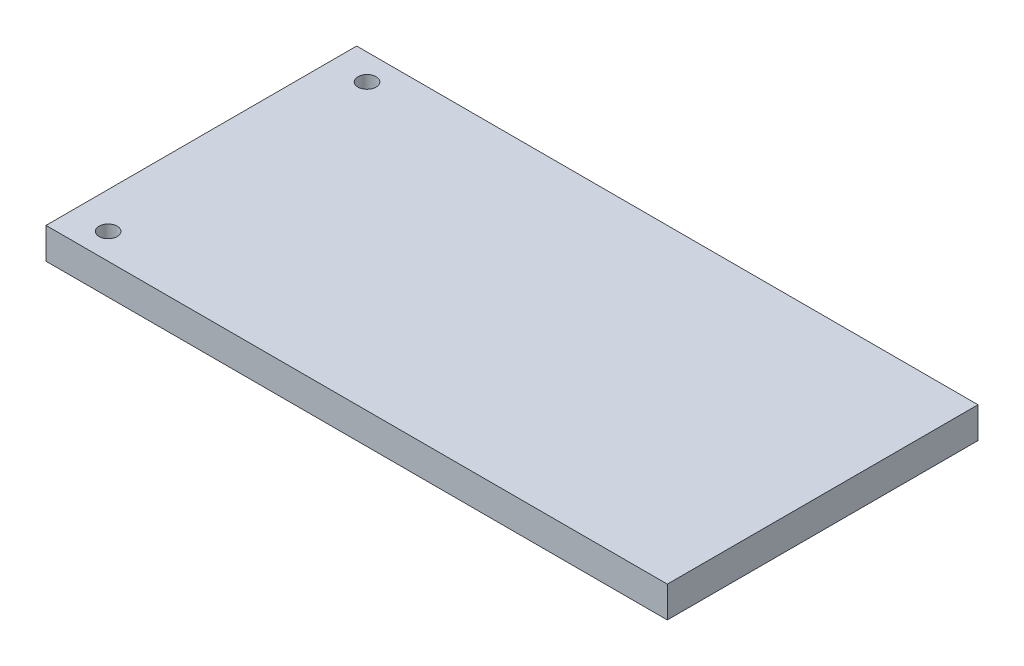
ISO-10303-21;
HEADER;
FILE_DESCRIPTION(('STEP AP214'),'2;1');
FILE_NAME('part.step','',(''),(''),'','','');
FILE_SCHEMA(('AUTOMOTIVE_DESIGN { 1 0 10303 214 1 1 1 1 }'));
ENDSEC;
DATA;
#1=APPLICATION_CONTEXT('core data for automotive mechanical design processes');
#2=APPLICATION_PROTOCOL_DEFINITION('international standard','automotive_design',2000,#1);
#3=PRODUCT_CONTEXT('',#1,'mechanical');
#4=PRODUCT('Part','Part','',(#3));
#5=PRODUCT_RELATED_PRODUCT_CATEGORY('part','',(#4));
#6=PRODUCT_DEFINITION_FORMATION('','',#4);
#7=PRODUCT_DEFINITION_CONTEXT('part definition',#1,'design');
#8=PRODUCT_DEFINITION('design','',#6,#7);
#9=PRODUCT_DEFINITION_SHAPE('','',#8);
#10=(LENGTH_UNIT() NAMED_UNIT(*) SI_UNIT(.MILLI.,.METRE.));
#11=(NAMED_UNIT(*) PLANE_ANGLE_UNIT() SI_UNIT($,.RADIAN.));
#12=(NAMED_UNIT(*) SI_UNIT($,.STERADIAN.) SOLID_ANGLE_UNIT());
#13=UNCERTAINTY_MEASURE_WITH_UNIT(LENGTH_MEASURE(1.E-05),#10,'distance_accuracy_value','');
#14=(GEOMETRIC_REPRESENTATION_CONTEXT(3) GLOBAL_UNCERTAINTY_ASSIGNED_CONTEXT((#13)) GLOBAL_UNIT_ASSIGNED_CONTEXT((#10,
#11,#12)) REPRESENTATION_CONTEXT('',''));
#15=CARTESIAN_POINT('',(0.,0.,0.));
#16=DIRECTION('',(0.,0.,1.));
#17=DIRECTION('',(1.,0.,0.));
#18=AXIS2_PLACEMENT_3D('',#15,#16,#17);
#19=CARTESIAN_POINT('',(0.,6.,0.));
#20=DIRECTION('',(0.,0.,1.));
#21=DIRECTION('',(1.,0.,0.));
#22=AXIS2_PLACEMENT_3D('',#19,#20,#21);
#23=PLANE('',#22);
#24=DIRECTION('',(-1.,0.,0.));
#25=VECTOR('',#24,1.);
#26=CARTESIAN_POINT('',(0.,0.,0.));
#27=LINE('',#26,#25);
#28=CARTESIAN_POINT('',(60.,0.,0.));
#29=VERTEX_POINT('',#28);
#30=CARTESIAN_POINT('',(-60.,0.,0.));
#31=VERTEX_POINT('',#30);
#32=EDGE_CURVE('E79',#29,#31,#27,.T.);
#33=ORIENTED_EDGE('',*,*,#32,.T.);
#34=DIRECTION('',(0.,-1.,0.));
#35=VECTOR('',#34,1.);
#36=CARTESIAN_POINT('',(-60.,6.,0.));
#37=LINE('',#36,#35);
#38=CARTESIAN_POINT('',(-60.,6.,0.));
#39=VERTEX_POINT('',#38);
#40=EDGE_CURVE('E11',#39,#31,#37,.T.);
#41=ORIENTED_EDGE('',*,*,#40,.F.);
#42=DIRECTION('',(-1.,0.,0.));
#43=VECTOR('',#42,1.);
#44=CARTESIAN_POINT('',(0.,6.,0.));
#45=LINE('',#44,#43);
#46=CARTESIAN_POINT('',(60.,6.,0.));
#47=VERTEX_POINT('',#46);
#48=EDGE_CURVE('E84',#47,#39,#45,.T.);
#49=ORIENTED_EDGE('',*,*,#48,.F.);
#50=DIRECTION('',(0.,-1.,0.));
#51=VECTOR('',#50,1.);
#52=CARTESIAN_POINT('',(60.,6.,0.));
#53=LINE('',#52,#51);
#54=EDGE_CURVE('E99',#47,#29,#53,.T.);
#55=ORIENTED_EDGE('',*,*,#54,.T.);
#56=EDGE_LOOP('',(#33,#41,#49,#55));
#57=FACE_BOUND('',#56,.T.);
#58=ADVANCED_FACE('F39',(#57),#23,.F.);
#59=CARTESIAN_POINT('',(-60.,6.,60.));
#60=DIRECTION('',(1.,0.,0.));
#61=DIRECTION('',(0.,0.,-1.));
#62=AXIS2_PLACEMENT_3D('',#59,#60,#61);
#63=PLANE('',#62);
#64=DIRECTION('',(0.,0.,1.));
#65=VECTOR('',#64,1.);
#66=CARTESIAN_POINT('',(-60.,0.,60.));
#67=LINE('',#66,#65);
#68=CARTESIAN_POINT('',(-60.,0.,60.));
#69=VERTEX_POINT('',#68);
#70=EDGE_CURVE('E95',#31,#69,#67,.T.);
#71=ORIENTED_EDGE('',*,*,#70,.T.);
#72=DIRECTION('',(0.,-1.,0.));
#73=VECTOR('',#72,1.);
#74=CARTESIAN_POINT('',(-60.,6.,60.));
#75=LINE('',#74,#73);
#76=CARTESIAN_POINT('',(-60.,6.,60.));
#77=VERTEX_POINT('',#76);
#78=EDGE_CURVE('E47',#77,#69,#75,.T.);
#79=ORIENTED_EDGE('',*,*,#78,.F.);
#80=DIRECTION('',(0.,0.,1.));
#81=VECTOR('',#80,1.);
#82=CARTESIAN_POINT('',(-60.,6.,60.));
#83=LINE('',#82,#81);
#84=EDGE_CURVE('E87',#39,#77,#83,.T.);
#85=ORIENTED_EDGE('',*,*,#84,.F.);
#86=ORIENTED_EDGE('',*,*,#40,.T.);
#87=EDGE_LOOP('',(#71,#79,#85,#86));
#88=FACE_BOUND('',#87,.T.);
#89=ADVANCED_FACE('F94',(#88),#63,.F.);
#90=CARTESIAN_POINT('',(60.,6.,60.));
#91=DIRECTION('',(0.,0.,-1.));
#92=DIRECTION('',(-1.,0.,0.));
#93=AXIS2_PLACEMENT_3D('',#90,#91,#92);
#94=PLANE('',#93);
#95=DIRECTION('',(1.,0.,0.));
#96=VECTOR('',#95,1.);
#97=CARTESIAN_POINT('',(60.,0.,60.));
#98=LINE('',#97,#96);
#99=CARTESIAN_POINT('',(60.,0.,60.));
#100=VERTEX_POINT('',#99);
#101=EDGE_CURVE('E72',#69,#100,#98,.T.);
#102=ORIENTED_EDGE('',*,*,#101,.T.);
#103=DIRECTION('',(0.,-1.,0.));
#104=VECTOR('',#103,1.);
#105=CARTESIAN_POINT('',(60.,6.,60.));
#106=LINE('',#105,#104);
#107=CARTESIAN_POINT('',(60.,6.,60.));
#108=VERTEX_POINT('',#107);
#109=EDGE_CURVE('E96',#108,#100,#106,.T.);
#110=ORIENTED_EDGE('',*,*,#109,.F.);
#111=DIRECTION('',(1.,0.,0.));
#112=VECTOR('',#111,1.);
#113=CARTESIAN_POINT('',(60.,6.,60.));
#114=LINE('',#113,#112);
#115=EDGE_CURVE('E91',#77,#108,#114,.T.);
#116=ORIENTED_EDGE('',*,*,#115,.F.);
#117=ORIENTED_EDGE('',*,*,#78,.T.);
#118=EDGE_LOOP('',(#102,#110,#116,#117));
#119=FACE_BOUND('',#118,.T.);
#120=ADVANCED_FACE('F97',(#119),#94,.F.);
#121=CARTESIAN_POINT('',(60.,6.,0.));
#122=DIRECTION('',(-1.,0.,0.));
#123=DIRECTION('',(0.,0.,1.));
#124=AXIS2_PLACEMENT_3D('',#121,#122,#123);
#125=PLANE('',#124);
#126=DIRECTION('',(0.,0.,-1.));
#127=VECTOR('',#126,1.);
#128=CARTESIAN_POINT('',(60.,0.,0.));
#129=LINE('',#128,#127);
#130=EDGE_CURVE('E107',#100,#29,#129,.T.);
#131=ORIENTED_EDGE('',*,*,#130,.T.);
#132=ORIENTED_EDGE('',*,*,#54,.F.);
#133=DIRECTION('',(0.,0.,-1.));
#134=VECTOR('',#133,1.);
#135=CARTESIAN_POINT('',(60.,6.,0.));
#136=LINE('',#135,#134);
#137=EDGE_CURVE('E55',#108,#47,#136,.T.);
#138=ORIENTED_EDGE('',*,*,#137,.F.);
#139=ORIENTED_EDGE('',*,*,#109,.T.);
#140=EDGE_LOOP('',(#131,#132,#138,#139));
#141=FACE_BOUND('',#140,.T.);
#142=ADVANCED_FACE('F112',(#141),#125,.F.);
#143=CARTESIAN_POINT('',(0.,6.,0.));
#144=DIRECTION('',(0.,-1.,0.));
#145=DIRECTION('',(0.,0.,-1.));
#146=AXIS2_PLACEMENT_3D('',#143,#144,#145);
#147=PLANE('',#146);
#148=CARTESIAN_POINT('',(-53.,6.,5.));
#149=DIRECTION('',(0.,1.,0.));
#150=DIRECTION('',(0.,0.,1.));
#151=AXIS2_PLACEMENT_3D('',#148,#149,#150);
#152=CIRCLE('',#151,1.75);
#153=CARTESIAN_POINT('',(-53.,6.,6.75));
#154=VERTEX_POINT('',#153);
#155=EDGE_CURVE('E142',#154,#154,#152,.T.);
#156=ORIENTED_EDGE('',*,*,#155,.F.);
#157=EDGE_LOOP('',(#156));
#158=FACE_BOUND('',#157,.T.);
#159=CARTESIAN_POINT('',(-53.,6.,55.));
#160=DIRECTION('',(0.,1.,0.));
#161=DIRECTION('',(0.,0.,1.));
#162=AXIS2_PLACEMENT_3D('',#159,#160,#161);
#163=CIRCLE('',#162,1.75);
#164=CARTESIAN_POINT('',(-53.,6.,56.75));
#165=VERTEX_POINT('',#164);
#166=EDGE_CURVE('E136',#165,#165,#163,.T.);
#167=ORIENTED_EDGE('',*,*,#166,.F.);
#168=EDGE_LOOP('',(#167));
#169=FACE_BOUND('',#168,.T.);
#170=ORIENTED_EDGE('',*,*,#48,.T.);
#171=ORIENTED_EDGE('',*,*,#84,.T.);
#172=ORIENTED_EDGE('',*,*,#115,.T.);
#173=ORIENTED_EDGE('',*,*,#137,.T.);
#174=EDGE_LOOP('',(#170,#171,#172,#173));
#175=FACE_BOUND('',#174,.T.);
#176=ADVANCED_FACE('F89',(#158,#169,#175),#147,.F.);
#177=CARTESIAN_POINT('',(0.,0.,0.));
#178=DIRECTION('',(0.,-1.,0.));
#179=DIRECTION('',(0.,0.,-1.));
#180=AXIS2_PLACEMENT_3D('',#177,#178,#179);
#181=PLANE('',#180);
#182=CARTESIAN_POINT('',(-53.,0.,5.));
#183=DIRECTION('',(0.,1.,0.));
#184=DIRECTION('',(0.,0.,1.));
#185=AXIS2_PLACEMENT_3D('',#182,#183,#184);
#186=CIRCLE('',#185,1.75);
#187=CARTESIAN_POINT('',(-53.,0.,6.75));
#188=VERTEX_POINT('',#187);
#189=EDGE_CURVE('E104',#188,#188,#186,.T.);
#190=ORIENTED_EDGE('',*,*,#189,.T.);
#191=EDGE_LOOP('',(#190));
#192=FACE_BOUND('',#191,.T.);
#193=CARTESIAN_POINT('',(-53.,0.,55.));
#194=DIRECTION('',(0.,1.,0.));
#195=DIRECTION('',(0.,0.,1.));
#196=AXIS2_PLACEMENT_3D('',#193,#194,#195);
#197=CIRCLE('',#196,1.75);
#198=CARTESIAN_POINT('',(-53.,0.,56.75));
#199=VERTEX_POINT('',#198);
#200=EDGE_CURVE('E139',#199,#199,#197,.T.);
#201=ORIENTED_EDGE('',*,*,#200,.T.);
#202=EDGE_LOOP('',(#201));
#203=FACE_BOUND('',#202,.T.);
#204=ORIENTED_EDGE('',*,*,#32,.F.);
#205=ORIENTED_EDGE('',*,*,#130,.F.);
#206=ORIENTED_EDGE('',*,*,#101,.F.);
#207=ORIENTED_EDGE('',*,*,#70,.F.);
#208=EDGE_LOOP('',(#204,#205,#206,#207));
#209=FACE_BOUND('',#208,.T.);
#210=ADVANCED_FACE('F113',(#192,#203,#209),#181,.T.);
#211=CARTESIAN_POINT('',(-53.,0.,55.));
#212=DIRECTION('',(0.,1.,0.));
#213=DIRECTION('',(0.,0.,1.));
#214=AXIS2_PLACEMENT_3D('',#211,#212,#213);
#215=CYLINDRICAL_SURFACE('',#214,1.75);
#216=ORIENTED_EDGE('',*,*,#200,.F.);
#217=EDGE_LOOP('',(#216));
#218=FACE_BOUND('',#217,.T.);
#219=ORIENTED_EDGE('',*,*,#166,.T.);
#220=EDGE_LOOP('',(#219));
#221=FACE_BOUND('',#220,.T.);
#222=ADVANCED_FACE('F115',(#218,#221),#215,.F.);
#223=CARTESIAN_POINT('',(-53.,0.,5.));
#224=DIRECTION('',(0.,1.,0.));
#225=DIRECTION('',(0.,0.,1.));
#226=AXIS2_PLACEMENT_3D('',#223,#224,#225);
#227=CYLINDRICAL_SURFACE('',#226,1.75);
#228=ORIENTED_EDGE('',*,*,#189,.F.);
#229=EDGE_LOOP('',(#228));
#230=FACE_BOUND('',#229,.T.);
#231=ORIENTED_EDGE('',*,*,#155,.T.);
#232=EDGE_LOOP('',(#231));
#233=FACE_BOUND('',#232,.T.);
#234=ADVANCED_FACE('F122',(#230,#233),#227,.F.);
#235=CLOSED_SHELL('',(#58,#89,#120,#142,#176,#210,#222,#234));
#236=MANIFOLD_SOLID_BREP('B2',#235);
#237=ADVANCED_BREP_SHAPE_REPRESENTATION('',(#18,#236),#14);
#238=SHAPE_DEFINITION_REPRESENTATION(#9,#237);
ENDSEC;
END-ISO-10303-21;
